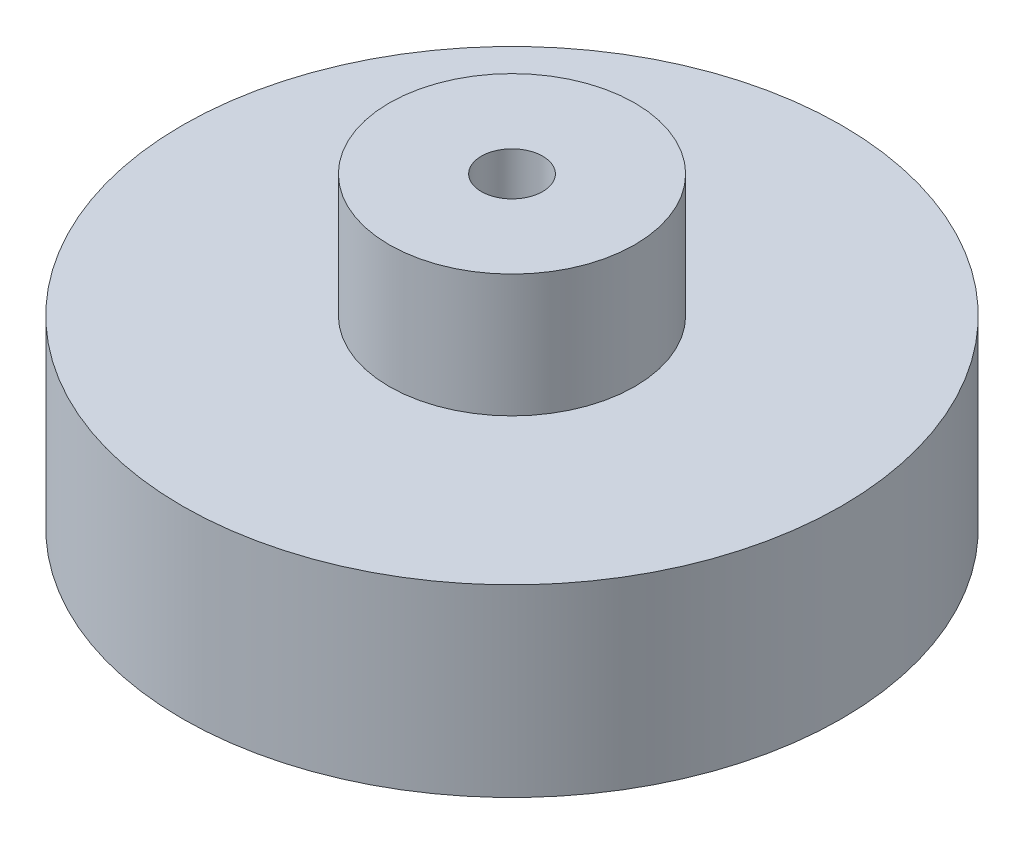
ISO-10303-21;
HEADER;
FILE_DESCRIPTION(('STEP AP214'),'2;1');
FILE_NAME('part.step','',(''),(''),'','','');
FILE_SCHEMA(('AUTOMOTIVE_DESIGN { 1 0 10303 214 1 1 1 1 }'));
ENDSEC;
DATA;
#1=APPLICATION_CONTEXT('core data for automotive mechanical design processes');
#2=APPLICATION_PROTOCOL_DEFINITION('international standard','automotive_design',2000,#1);
#3=PRODUCT_CONTEXT('',#1,'mechanical');
#4=PRODUCT('Part','Part','',(#3));
#5=PRODUCT_RELATED_PRODUCT_CATEGORY('part','',(#4));
#6=PRODUCT_DEFINITION_FORMATION('','',#4);
#7=PRODUCT_DEFINITION_CONTEXT('part definition',#1,'design');
#8=PRODUCT_DEFINITION('design','',#6,#7);
#9=PRODUCT_DEFINITION_SHAPE('','',#8);
#10=(LENGTH_UNIT() NAMED_UNIT(*) SI_UNIT(.MILLI.,.METRE.));
#11=(NAMED_UNIT(*) PLANE_ANGLE_UNIT() SI_UNIT($,.RADIAN.));
#12=(NAMED_UNIT(*) SI_UNIT($,.STERADIAN.) SOLID_ANGLE_UNIT());
#13=UNCERTAINTY_MEASURE_WITH_UNIT(LENGTH_MEASURE(1.E-05),#10,'distance_accuracy_value','');
#14=(GEOMETRIC_REPRESENTATION_CONTEXT(3) GLOBAL_UNCERTAINTY_ASSIGNED_CONTEXT((#13)) GLOBAL_UNIT_ASSIGNED_CONTEXT((#10,
#11,#12)) REPRESENTATION_CONTEXT('',''));
#15=CARTESIAN_POINT('',(0.,0.,0.));
#16=DIRECTION('',(0.,0.,1.));
#17=DIRECTION('',(1.,0.,0.));
#18=AXIS2_PLACEMENT_3D('',#15,#16,#17);
#19=CARTESIAN_POINT('',(0.,15.,0.));
#20=DIRECTION('',(0.,1.,0.));
#21=DIRECTION('',(0.,0.,1.));
#22=AXIS2_PLACEMENT_3D('',#19,#20,#21);
#23=PLANE('',#22);
#24=CARTESIAN_POINT('',(0.,15.,0.));
#25=DIRECTION('',(0.,1.,0.));
#26=DIRECTION('',(0.,0.,1.));
#27=AXIS2_PLACEMENT_3D('',#24,#25,#26);
#28=CIRCLE('',#27,26.85);
#29=CARTESIAN_POINT('',(0.,15.,26.85));
#30=VERTEX_POINT('',#29);
#31=EDGE_CURVE('E10',#30,#30,#28,.T.);
#32=ORIENTED_EDGE('',*,*,#31,.T.);
#33=EDGE_LOOP('',(#32));
#34=FACE_BOUND('',#33,.T.);
#35=CARTESIAN_POINT('',(0.,15.,0.));
#36=DIRECTION('',(0.,1.,0.));
#37=DIRECTION('',(0.,0.,1.));
#38=AXIS2_PLACEMENT_3D('',#35,#36,#37);
#39=CIRCLE('',#38,10.);
#40=CARTESIAN_POINT('',(0.,15.,10.));
#41=VERTEX_POINT('',#40);
#42=EDGE_CURVE('E46',#41,#41,#39,.T.);
#43=ORIENTED_EDGE('',*,*,#42,.F.);
#44=EDGE_LOOP('',(#43));
#45=FACE_BOUND('',#44,.T.);
#46=ADVANCED_FACE('F33',(#34,#45),#23,.T.);
#47=CARTESIAN_POINT('',(0.,15.,0.));
#48=DIRECTION('',(0.,-1.,0.));
#49=DIRECTION('',(0.,0.,-1.));
#50=AXIS2_PLACEMENT_3D('',#47,#48,#49);
#51=CYLINDRICAL_SURFACE('',#50,26.85);
#52=ORIENTED_EDGE('',*,*,#31,.F.);
#53=EDGE_LOOP('',(#52));
#54=FACE_BOUND('',#53,.T.);
#55=CARTESIAN_POINT('',(0.,0.,0.));
#56=DIRECTION('',(0.,1.,0.));
#57=DIRECTION('',(0.,0.,1.));
#58=AXIS2_PLACEMENT_3D('',#55,#56,#57);
#59=CIRCLE('',#58,26.85);
#60=CARTESIAN_POINT('',(0.,0.,26.85));
#61=VERTEX_POINT('',#60);
#62=EDGE_CURVE('E37',#61,#61,#59,.T.);
#63=ORIENTED_EDGE('',*,*,#62,.T.);
#64=EDGE_LOOP('',(#63));
#65=FACE_BOUND('',#64,.T.);
#66=ADVANCED_FACE('F35',(#54,#65),#51,.T.);
#67=CARTESIAN_POINT('',(0.,0.,0.));
#68=DIRECTION('',(0.,1.,0.));
#69=DIRECTION('',(0.,0.,1.));
#70=AXIS2_PLACEMENT_3D('',#67,#68,#69);
#71=PLANE('',#70);
#72=CARTESIAN_POINT('',(0.,0.,0.));
#73=DIRECTION('',(0.,-1.,0.));
#74=DIRECTION('',(0.,0.,-1.));
#75=AXIS2_PLACEMENT_3D('',#72,#73,#74);
#76=CIRCLE('',#75,2.5);
#77=CARTESIAN_POINT('',(0.,0.,-2.5));
#78=VERTEX_POINT('',#77);
#79=EDGE_CURVE('E52',#78,#78,#76,.T.);
#80=ORIENTED_EDGE('',*,*,#79,.F.);
#81=EDGE_LOOP('',(#80));
#82=FACE_BOUND('',#81,.T.);
#83=ORIENTED_EDGE('',*,*,#62,.F.);
#84=EDGE_LOOP('',(#83));
#85=FACE_BOUND('',#84,.T.);
#86=ADVANCED_FACE('F67',(#82,#85),#71,.F.);
#87=CARTESIAN_POINT('',(0.,25.,0.));
#88=DIRECTION('',(0.,-1.,0.));
#89=DIRECTION('',(0.,0.,-1.));
#90=AXIS2_PLACEMENT_3D('',#87,#88,#89);
#91=CYLINDRICAL_SURFACE('',#90,10.);
#92=CARTESIAN_POINT('',(0.,25.,0.));
#93=DIRECTION('',(0.,1.,0.));
#94=DIRECTION('',(0.,0.,1.));
#95=AXIS2_PLACEMENT_3D('',#92,#93,#94);
#96=CIRCLE('',#95,10.);
#97=CARTESIAN_POINT('',(0.,25.,10.));
#98=VERTEX_POINT('',#97);
#99=EDGE_CURVE('E44',#98,#98,#96,.T.);
#100=ORIENTED_EDGE('',*,*,#99,.F.);
#101=EDGE_LOOP('',(#100));
#102=FACE_BOUND('',#101,.T.);
#103=ORIENTED_EDGE('',*,*,#42,.T.);
#104=EDGE_LOOP('',(#103));
#105=FACE_BOUND('',#104,.T.);
#106=ADVANCED_FACE('F70',(#102,#105),#91,.T.);
#107=CARTESIAN_POINT('',(0.,25.,0.));
#108=DIRECTION('',(0.,1.,0.));
#109=DIRECTION('',(0.,0.,1.));
#110=AXIS2_PLACEMENT_3D('',#107,#108,#109);
#111=PLANE('',#110);
#112=CARTESIAN_POINT('',(0.,25.,0.));
#113=DIRECTION('',(0.,-1.,0.));
#114=DIRECTION('',(0.,0.,-1.));
#115=AXIS2_PLACEMENT_3D('',#112,#113,#114);
#116=CIRCLE('',#115,2.5);
#117=CARTESIAN_POINT('',(0.,25.,-2.5));
#118=VERTEX_POINT('',#117);
#119=EDGE_CURVE('E49',#118,#118,#116,.T.);
#120=ORIENTED_EDGE('',*,*,#119,.T.);
#121=EDGE_LOOP('',(#120));
#122=FACE_BOUND('',#121,.T.);
#123=ORIENTED_EDGE('',*,*,#99,.T.);
#124=EDGE_LOOP('',(#123));
#125=FACE_BOUND('',#124,.T.);
#126=ADVANCED_FACE('F58',(#122,#125),#111,.T.);
#127=CARTESIAN_POINT('',(0.,25.,0.));
#128=DIRECTION('',(0.,-1.,0.));
#129=DIRECTION('',(0.,0.,-1.));
#130=AXIS2_PLACEMENT_3D('',#127,#128,#129);
#131=CYLINDRICAL_SURFACE('',#130,2.5);
#132=ORIENTED_EDGE('',*,*,#119,.F.);
#133=EDGE_LOOP('',(#132));
#134=FACE_BOUND('',#133,.T.);
#135=ORIENTED_EDGE('',*,*,#79,.T.);
#136=EDGE_LOOP('',(#135));
#137=FACE_BOUND('',#136,.T.);
#138=ADVANCED_FACE('F61',(#134,#137),#131,.F.);
#139=CLOSED_SHELL('',(#46,#66,#86,#106,#126,#138));
#140=MANIFOLD_SOLID_BREP('B2',#139);
#141=ADVANCED_BREP_SHAPE_REPRESENTATION('',(#18,#140),#14);
#142=SHAPE_DEFINITION_REPRESENTATION(#9,#141);
ENDSEC;
END-ISO-10303-21;
